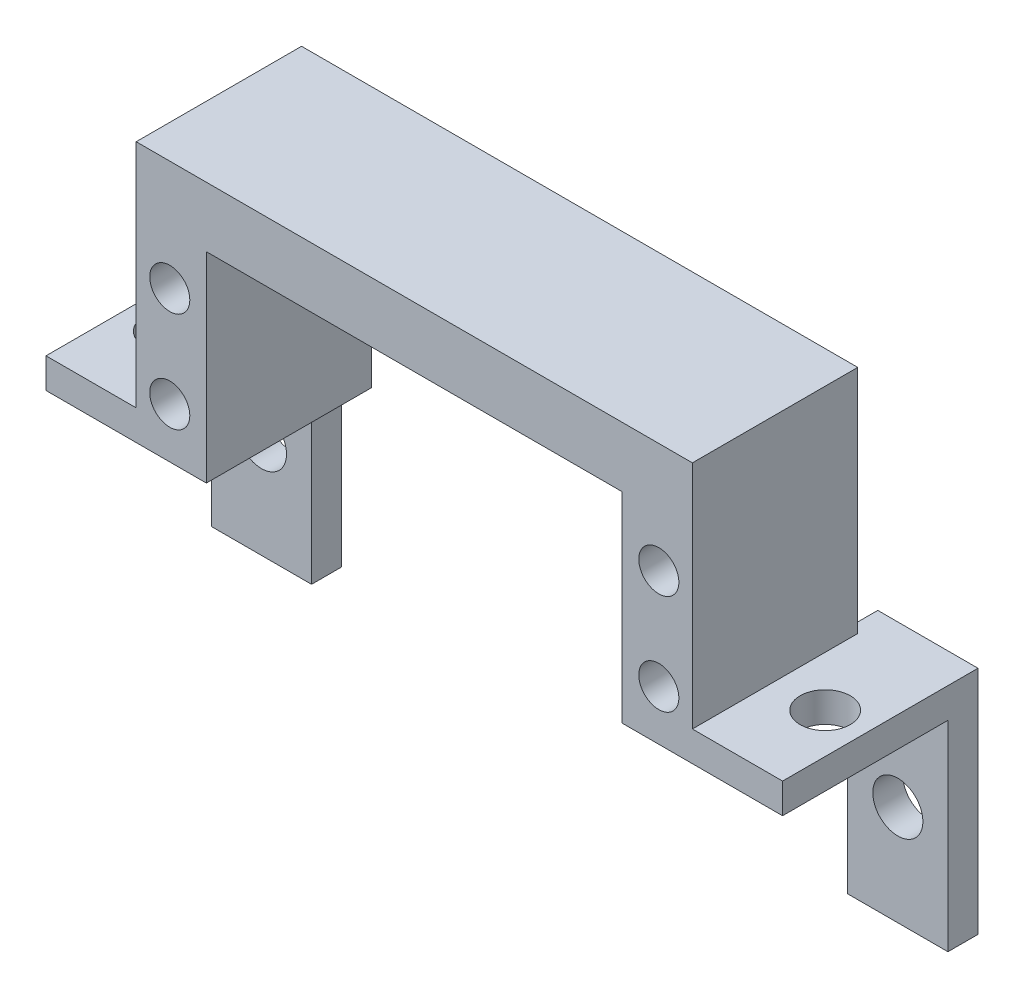
ISO-10303-21;
HEADER;
FILE_DESCRIPTION(('STEP AP214'),'2;1');
FILE_NAME('part.step','',(''),(''),'','','');
FILE_SCHEMA(('AUTOMOTIVE_DESIGN { 1 0 10303 214 1 1 1 1 }'));
ENDSEC;
DATA;
#1=APPLICATION_CONTEXT('core data for automotive mechanical design processes');
#2=APPLICATION_PROTOCOL_DEFINITION('international standard','automotive_design',2000,#1);
#3=PRODUCT_CONTEXT('',#1,'mechanical');
#4=PRODUCT('Part','Part','',(#3));
#5=PRODUCT_RELATED_PRODUCT_CATEGORY('part','',(#4));
#6=PRODUCT_DEFINITION_FORMATION('','',#4);
#7=PRODUCT_DEFINITION_CONTEXT('part definition',#1,'design');
#8=PRODUCT_DEFINITION('design','',#6,#7);
#9=PRODUCT_DEFINITION_SHAPE('','',#8);
#10=(LENGTH_UNIT() NAMED_UNIT(*) SI_UNIT(.MILLI.,.METRE.));
#11=(NAMED_UNIT(*) PLANE_ANGLE_UNIT() SI_UNIT($,.RADIAN.));
#12=(NAMED_UNIT(*) SI_UNIT($,.STERADIAN.) SOLID_ANGLE_UNIT());
#13=UNCERTAINTY_MEASURE_WITH_UNIT(LENGTH_MEASURE(1.E-05),#10,'distance_accuracy_value','');
#14=(GEOMETRIC_REPRESENTATION_CONTEXT(3) GLOBAL_UNCERTAINTY_ASSIGNED_CONTEXT((#13)) GLOBAL_UNIT_ASSIGNED_CONTEXT((#10,
#11,#12)) REPRESENTATION_CONTEXT('',''));
#15=CARTESIAN_POINT('',(0.,0.,0.));
#16=DIRECTION('',(0.,0.,1.));
#17=DIRECTION('',(1.,0.,0.));
#18=AXIS2_PLACEMENT_3D('',#15,#16,#17);
#19=CARTESIAN_POINT('',(0.,-23.,0.));
#20=DIRECTION('',(0.,-1.,0.));
#21=DIRECTION('',(0.,0.,-1.));
#22=AXIS2_PLACEMENT_3D('',#19,#20,#21);
#23=PLANE('',#22);
#24=CARTESIAN_POINT('',(32.75,-23.,8.25));
#25=DIRECTION('',(0.,-1.,0.));
#26=DIRECTION('',(0.,0.,-1.));
#27=AXIS2_PLACEMENT_3D('',#24,#25,#26);
#28=CIRCLE('',#27,2.5);
#29=CARTESIAN_POINT('',(32.75,-23.,5.75));
#30=VERTEX_POINT('',#29);
#31=EDGE_CURVE('E298',#30,#30,#28,.F.);
#32=ORIENTED_EDGE('',*,*,#31,.F.);
#33=EDGE_LOOP('',(#32));
#34=FACE_BOUND('',#33,.T.);
#35=DIRECTION('',(-1.,0.,0.));
#36=VECTOR('',#35,1.);
#37=CARTESIAN_POINT('',(27.75,-23.,0.));
#38=LINE('',#37,#36);
#39=CARTESIAN_POINT('',(27.75,-23.,0.));
#40=VERTEX_POINT('',#39);
#41=CARTESIAN_POINT('',(26.75,-23.,0.));
#42=VERTEX_POINT('',#41);
#43=EDGE_CURVE('E182',#40,#42,#38,.T.);
#44=ORIENTED_EDGE('',*,*,#43,.F.);
#45=DIRECTION('',(0.,0.,-1.));
#46=VECTOR('',#45,1.);
#47=CARTESIAN_POINT('',(27.75,-23.,16.5));
#48=LINE('',#47,#46);
#49=CARTESIAN_POINT('',(27.75,-23.,16.5));
#50=VERTEX_POINT('',#49);
#51=EDGE_CURVE('E170',#50,#40,#48,.T.);
#52=ORIENTED_EDGE('',*,*,#51,.F.);
#53=DIRECTION('',(1.,0.,0.));
#54=VECTOR('',#53,1.);
#55=CARTESIAN_POINT('',(36.75,-23.,16.5));
#56=LINE('',#55,#54);
#57=CARTESIAN_POINT('',(36.75,-23.,16.5));
#58=VERTEX_POINT('',#57);
#59=EDGE_CURVE('E296',#50,#58,#56,.T.);
#60=ORIENTED_EDGE('',*,*,#59,.T.);
#61=DIRECTION('',(0.,0.,-1.));
#62=VECTOR('',#61,1.);
#63=CARTESIAN_POINT('',(36.75,-23.,0.));
#64=LINE('',#63,#62);
#65=CARTESIAN_POINT('',(36.75,-23.,-3.));
#66=VERTEX_POINT('',#65);
#67=EDGE_CURVE('E294',#58,#66,#64,.T.);
#68=ORIENTED_EDGE('',*,*,#67,.T.);
#69=DIRECTION('',(1.,0.,0.));
#70=VECTOR('',#69,1.);
#71=CARTESIAN_POINT('',(26.75,-23.,-3.));
#72=LINE('',#71,#70);
#73=CARTESIAN_POINT('',(26.75,-23.,-3.));
#74=VERTEX_POINT('',#73);
#75=EDGE_CURVE('E247',#74,#66,#72,.T.);
#76=ORIENTED_EDGE('',*,*,#75,.F.);
#77=DIRECTION('',(0.,0.,1.));
#78=VECTOR('',#77,1.);
#79=CARTESIAN_POINT('',(26.75,-23.,-3.));
#80=LINE('',#79,#78);
#81=EDGE_CURVE('E189',#74,#42,#80,.T.);
#82=ORIENTED_EDGE('',*,*,#81,.T.);
#83=EDGE_LOOP('',(#44,#52,#60,#68,#76,#82));
#84=FACE_BOUND('',#83,.T.);
#85=ADVANCED_FACE('F37',(#34,#84),#23,.F.);
#86=CARTESIAN_POINT('',(0.,-23.,0.));
#87=DIRECTION('',(0.,1.,0.));
#88=DIRECTION('',(0.,0.,1.));
#89=AXIS2_PLACEMENT_3D('',#86,#87,#88);
#90=PLANE('',#89);
#91=CARTESIAN_POINT('',(-32.75,-23.,8.25));
#92=DIRECTION('',(0.,1.,0.));
#93=DIRECTION('',(0.,0.,1.));
#94=AXIS2_PLACEMENT_3D('',#91,#92,#93);
#95=CIRCLE('',#94,2.5);
#96=CARTESIAN_POINT('',(-32.75,-23.,10.75));
#97=VERTEX_POINT('',#96);
#98=EDGE_CURVE('E41',#97,#97,#95,.F.);
#99=ORIENTED_EDGE('',*,*,#98,.T.);
#100=EDGE_LOOP('',(#99));
#101=FACE_BOUND('',#100,.T.);
#102=DIRECTION('',(0.,0.,1.));
#103=VECTOR('',#102,1.);
#104=CARTESIAN_POINT('',(-27.75,-23.,0.));
#105=LINE('',#104,#103);
#106=CARTESIAN_POINT('',(-27.75,-23.,0.));
#107=VERTEX_POINT('',#106);
#108=CARTESIAN_POINT('',(-27.75,-23.,16.5));
#109=VERTEX_POINT('',#108);
#110=EDGE_CURVE('E63',#107,#109,#105,.T.);
#111=ORIENTED_EDGE('',*,*,#110,.F.);
#112=DIRECTION('',(1.,0.,0.));
#113=VECTOR('',#112,1.);
#114=CARTESIAN_POINT('',(-27.75,-23.,0.));
#115=LINE('',#114,#113);
#116=CARTESIAN_POINT('',(-26.75,-23.,0.));
#117=VERTEX_POINT('',#116);
#118=EDGE_CURVE('E202',#107,#117,#115,.T.);
#119=ORIENTED_EDGE('',*,*,#118,.T.);
#120=DIRECTION('',(0.,0.,1.));
#121=VECTOR('',#120,1.);
#122=CARTESIAN_POINT('',(-26.75,-23.,-3.));
#123=LINE('',#122,#121);
#124=CARTESIAN_POINT('',(-26.75,-23.,-3.));
#125=VERTEX_POINT('',#124);
#126=EDGE_CURVE('E228',#125,#117,#123,.T.);
#127=ORIENTED_EDGE('',*,*,#126,.F.);
#128=DIRECTION('',(1.,0.,0.));
#129=VECTOR('',#128,1.);
#130=CARTESIAN_POINT('',(-26.75,-23.,-3.));
#131=LINE('',#130,#129);
#132=CARTESIAN_POINT('',(-36.75,-23.,-3.));
#133=VERTEX_POINT('',#132);
#134=EDGE_CURVE('E226',#133,#125,#131,.T.);
#135=ORIENTED_EDGE('',*,*,#134,.F.);
#136=DIRECTION('',(0.,0.,1.));
#137=VECTOR('',#136,1.);
#138=CARTESIAN_POINT('',(-36.75,-23.,0.));
#139=LINE('',#138,#137);
#140=CARTESIAN_POINT('',(-36.75,-23.,16.5));
#141=VERTEX_POINT('',#140);
#142=EDGE_CURVE('E288',#133,#141,#139,.T.);
#143=ORIENTED_EDGE('',*,*,#142,.T.);
#144=DIRECTION('',(1.,0.,0.));
#145=VECTOR('',#144,1.);
#146=CARTESIAN_POINT('',(-36.75,-23.,16.5));
#147=LINE('',#146,#145);
#148=EDGE_CURVE('E292',#141,#109,#147,.T.);
#149=ORIENTED_EDGE('',*,*,#148,.T.);
#150=EDGE_LOOP('',(#111,#119,#127,#135,#143,#149));
#151=FACE_BOUND('',#150,.T.);
#152=ADVANCED_FACE('F361',(#101,#151),#90,.T.);
#153=CARTESIAN_POINT('',(0.,0.,0.));
#154=DIRECTION('',(0.,0.,1.));
#155=DIRECTION('',(1.,0.,0.));
#156=AXIS2_PLACEMENT_3D('',#153,#154,#155);
#157=PLANE('',#156);
#158=CARTESIAN_POINT('',(24.4,-21.,0.));
#159=DIRECTION('',(0.,0.,-1.));
#160=DIRECTION('',(-1.,0.,0.));
#161=AXIS2_PLACEMENT_3D('',#158,#159,#160);
#162=CIRCLE('',#161,2.00000000000001);
#163=CARTESIAN_POINT('',(22.4,-21.,0.));
#164=VERTEX_POINT('',#163);
#165=EDGE_CURVE('E271',#164,#164,#162,.T.);
#166=ORIENTED_EDGE('',*,*,#165,.F.);
#167=EDGE_LOOP('',(#166));
#168=FACE_BOUND('',#167,.T.);
#169=CARTESIAN_POINT('',(-24.4,-21.,0.));
#170=DIRECTION('',(0.,0.,-1.));
#171=DIRECTION('',(1.,0.,0.));
#172=AXIS2_PLACEMENT_3D('',#169,#170,#171);
#173=CIRCLE('',#172,2.00000000000001);
#174=CARTESIAN_POINT('',(-22.4,-21.,0.));
#175=VERTEX_POINT('',#174);
#176=EDGE_CURVE('E277',#175,#175,#173,.T.);
#177=ORIENTED_EDGE('',*,*,#176,.F.);
#178=EDGE_LOOP('',(#177));
#179=FACE_BOUND('',#178,.T.);
#180=CARTESIAN_POINT('',(-24.4,-11.,0.));
#181=DIRECTION('',(0.,0.,-1.));
#182=DIRECTION('',(1.,0.,0.));
#183=AXIS2_PLACEMENT_3D('',#180,#181,#182);
#184=CIRCLE('',#183,2.);
#185=CARTESIAN_POINT('',(-22.4,-11.,0.));
#186=VERTEX_POINT('',#185);
#187=EDGE_CURVE('E266',#186,#186,#184,.T.);
#188=ORIENTED_EDGE('',*,*,#187,.F.);
#189=EDGE_LOOP('',(#188));
#190=FACE_BOUND('',#189,.T.);
#191=CARTESIAN_POINT('',(24.4,-11.,0.));
#192=DIRECTION('',(0.,0.,-1.));
#193=DIRECTION('',(-1.,0.,0.));
#194=AXIS2_PLACEMENT_3D('',#191,#192,#193);
#195=CIRCLE('',#194,2.);
#196=CARTESIAN_POINT('',(22.4,-11.,0.));
#197=VERTEX_POINT('',#196);
#198=EDGE_CURVE('E270',#197,#197,#195,.T.);
#199=ORIENTED_EDGE('',*,*,#198,.F.);
#200=EDGE_LOOP('',(#199));
#201=FACE_BOUND('',#200,.T.);
#202=DIRECTION('',(0.,-1.,0.));
#203=VECTOR('',#202,1.);
#204=CARTESIAN_POINT('',(-26.75,-23.,0.));
#205=LINE('',#204,#203);
#206=CARTESIAN_POINT('',(-26.75,-26.,0.));
#207=VERTEX_POINT('',#206);
#208=EDGE_CURVE('E229',#117,#207,#205,.T.);
#209=ORIENTED_EDGE('',*,*,#208,.F.);
#210=ORIENTED_EDGE('',*,*,#118,.F.);
#211=DIRECTION('',(0.,-1.,0.));
#212=VECTOR('',#211,1.);
#213=CARTESIAN_POINT('',(-27.75,0.,0.));
#214=LINE('',#213,#212);
#215=CARTESIAN_POINT('',(-27.75,0.,0.));
#216=VERTEX_POINT('',#215);
#217=EDGE_CURVE('E190',#216,#107,#214,.T.);
#218=ORIENTED_EDGE('',*,*,#217,.F.);
#219=DIRECTION('',(-1.,0.,0.));
#220=VECTOR('',#219,1.);
#221=CARTESIAN_POINT('',(0.,0.,0.));
#222=LINE('',#221,#220);
#223=CARTESIAN_POINT('',(27.75,0.,0.));
#224=VERTEX_POINT('',#223);
#225=EDGE_CURVE('E184',#224,#216,#222,.T.);
#226=ORIENTED_EDGE('',*,*,#225,.F.);
#227=DIRECTION('',(0.,1.,0.));
#228=VECTOR('',#227,1.);
#229=CARTESIAN_POINT('',(27.75,0.,0.));
#230=LINE('',#229,#228);
#231=EDGE_CURVE('E173',#40,#224,#230,.T.);
#232=ORIENTED_EDGE('',*,*,#231,.F.);
#233=ORIENTED_EDGE('',*,*,#43,.T.);
#234=DIRECTION('',(0.,1.,0.));
#235=VECTOR('',#234,1.);
#236=CARTESIAN_POINT('',(26.75,-23.,0.));
#237=LINE('',#236,#235);
#238=CARTESIAN_POINT('',(26.75,-26.,0.));
#239=VERTEX_POINT('',#238);
#240=EDGE_CURVE('E11',#239,#42,#237,.T.);
#241=ORIENTED_EDGE('',*,*,#240,.F.);
#242=DIRECTION('',(1.,0.,0.));
#243=VECTOR('',#242,1.);
#244=CARTESIAN_POINT('',(20.75,-26.,0.));
#245=LINE('',#244,#243);
#246=CARTESIAN_POINT('',(20.75,-26.,0.));
#247=VERTEX_POINT('',#246);
#248=EDGE_CURVE('E306',#247,#239,#245,.T.);
#249=ORIENTED_EDGE('',*,*,#248,.F.);
#250=DIRECTION('',(0.,-1.,0.));
#251=VECTOR('',#250,1.);
#252=CARTESIAN_POINT('',(20.75,-6.,0.));
#253=LINE('',#252,#251);
#254=CARTESIAN_POINT('',(20.75,-6.,0.));
#255=VERTEX_POINT('',#254);
#256=EDGE_CURVE('E332',#255,#247,#253,.T.);
#257=ORIENTED_EDGE('',*,*,#256,.F.);
#258=DIRECTION('',(1.,0.,0.));
#259=VECTOR('',#258,1.);
#260=CARTESIAN_POINT('',(0.,-6.,0.));
#261=LINE('',#260,#259);
#262=CARTESIAN_POINT('',(-20.75,-6.,0.));
#263=VERTEX_POINT('',#262);
#264=EDGE_CURVE('E330',#263,#255,#261,.T.);
#265=ORIENTED_EDGE('',*,*,#264,.F.);
#266=DIRECTION('',(0.,1.,0.));
#267=VECTOR('',#266,1.);
#268=CARTESIAN_POINT('',(-20.75,-6.,0.));
#269=LINE('',#268,#267);
#270=CARTESIAN_POINT('',(-20.75,-26.,0.));
#271=VERTEX_POINT('',#270);
#272=EDGE_CURVE('E327',#271,#263,#269,.T.);
#273=ORIENTED_EDGE('',*,*,#272,.F.);
#274=DIRECTION('',(1.,0.,0.));
#275=VECTOR('',#274,1.);
#276=CARTESIAN_POINT('',(-20.75,-26.,0.));
#277=LINE('',#276,#275);
#278=EDGE_CURVE('E323',#207,#271,#277,.T.);
#279=ORIENTED_EDGE('',*,*,#278,.F.);
#280=EDGE_LOOP('',(#209,#210,#218,#226,#232,#233,#241,#249,#257,#265,#273,#279));
#281=FACE_BOUND('',#280,.T.);
#282=ADVANCED_FACE('F181',(#168,#179,#190,#201,#281),#157,.F.);
#283=CARTESIAN_POINT('',(-36.75,-20.,16.5));
#284=DIRECTION('',(1.,0.,0.));
#285=DIRECTION('',(0.,0.,-1.));
#286=AXIS2_PLACEMENT_3D('',#283,#284,#285);
#287=PLANE('',#286);
#288=ORIENTED_EDGE('',*,*,#142,.F.);
#289=DIRECTION('',(0.,1.,0.));
#290=VECTOR('',#289,1.);
#291=CARTESIAN_POINT('',(-36.75,-23.,-3.));
#292=LINE('',#291,#290);
#293=CARTESIAN_POINT('',(-36.75,-46.,-3.));
#294=VERTEX_POINT('',#293);
#295=EDGE_CURVE('E223',#294,#133,#292,.T.);
#296=ORIENTED_EDGE('',*,*,#295,.F.);
#297=DIRECTION('',(0.,0.,1.));
#298=VECTOR('',#297,1.);
#299=CARTESIAN_POINT('',(-36.75,-46.,-3.));
#300=LINE('',#299,#298);
#301=CARTESIAN_POINT('',(-36.75,-46.,0.));
#302=VERTEX_POINT('',#301);
#303=EDGE_CURVE('E238',#294,#302,#300,.T.);
#304=ORIENTED_EDGE('',*,*,#303,.T.);
#305=DIRECTION('',(0.,1.,0.));
#306=VECTOR('',#305,1.);
#307=CARTESIAN_POINT('',(-36.75,-23.,0.));
#308=LINE('',#307,#306);
#309=CARTESIAN_POINT('',(-36.75,-26.,0.));
#310=VERTEX_POINT('',#309);
#311=EDGE_CURVE('E221',#302,#310,#308,.T.);
#312=ORIENTED_EDGE('',*,*,#311,.T.);
#313=DIRECTION('',(0.,0.,-1.));
#314=VECTOR('',#313,1.);
#315=CARTESIAN_POINT('',(-36.75,-26.,16.5));
#316=LINE('',#315,#314);
#317=CARTESIAN_POINT('',(-36.75,-26.,16.5));
#318=VERTEX_POINT('',#317);
#319=EDGE_CURVE('E46',#318,#310,#316,.T.);
#320=ORIENTED_EDGE('',*,*,#319,.F.);
#321=DIRECTION('',(0.,-1.,0.));
#322=VECTOR('',#321,1.);
#323=CARTESIAN_POINT('',(-36.75,-20.,16.5));
#324=LINE('',#323,#322);
#325=EDGE_CURVE('E305',#141,#318,#324,.T.);
#326=ORIENTED_EDGE('',*,*,#325,.F.);
#327=EDGE_LOOP('',(#288,#296,#304,#312,#320,#326));
#328=FACE_BOUND('',#327,.T.);
#329=ADVANCED_FACE('F373',(#328),#287,.F.);
#330=CARTESIAN_POINT('',(-32.75,-36.5,8.25));
#331=DIRECTION('',(0.,1.,0.));
#332=DIRECTION('',(0.,0.,1.));
#333=AXIS2_PLACEMENT_3D('',#330,#331,#332);
#334=CYLINDRICAL_SURFACE('',#333,2.5);
#335=CARTESIAN_POINT('',(-32.75,-26.,8.25));
#336=DIRECTION('',(0.,1.,0.));
#337=DIRECTION('',(-1.,0.,0.));
#338=AXIS2_PLACEMENT_3D('',#335,#336,#337);
#339=CIRCLE('',#338,2.5);
#340=CARTESIAN_POINT('',(-35.25,-26.,8.25));
#341=VERTEX_POINT('',#340);
#342=EDGE_CURVE('E302',#341,#341,#339,.T.);
#343=ORIENTED_EDGE('',*,*,#342,.F.);
#344=EDGE_LOOP('',(#343));
#345=FACE_BOUND('',#344,.T.);
#346=ORIENTED_EDGE('',*,*,#98,.F.);
#347=EDGE_LOOP('',(#346));
#348=FACE_BOUND('',#347,.T.);
#349=ADVANCED_FACE('F370',(#345,#348),#334,.F.);
#350=CARTESIAN_POINT('',(0.,0.,16.5));
#351=DIRECTION('',(0.,-1.,0.));
#352=DIRECTION('',(0.,0.,-1.));
#353=AXIS2_PLACEMENT_3D('',#350,#351,#352);
#354=PLANE('',#353);
#355=ORIENTED_EDGE('',*,*,#225,.T.);
#356=DIRECTION('',(0.,0.,-1.));
#357=VECTOR('',#356,1.);
#358=CARTESIAN_POINT('',(-27.75,0.,0.));
#359=LINE('',#358,#357);
#360=CARTESIAN_POINT('',(-27.75,0.,16.5));
#361=VERTEX_POINT('',#360);
#362=EDGE_CURVE('E199',#361,#216,#359,.T.);
#363=ORIENTED_EDGE('',*,*,#362,.F.);
#364=DIRECTION('',(-1.,0.,0.));
#365=VECTOR('',#364,1.);
#366=CARTESIAN_POINT('',(0.,0.,16.5));
#367=LINE('',#366,#365);
#368=CARTESIAN_POINT('',(27.75,0.,16.5));
#369=VERTEX_POINT('',#368);
#370=EDGE_CURVE('E303',#369,#361,#367,.T.);
#371=ORIENTED_EDGE('',*,*,#370,.F.);
#372=DIRECTION('',(0.,0.,1.));
#373=VECTOR('',#372,1.);
#374=CARTESIAN_POINT('',(27.75,0.,16.5));
#375=LINE('',#374,#373);
#376=EDGE_CURVE('E185',#224,#369,#375,.T.);
#377=ORIENTED_EDGE('',*,*,#376,.F.);
#378=EDGE_LOOP('',(#355,#363,#371,#377));
#379=FACE_BOUND('',#378,.T.);
#380=ADVANCED_FACE('F39',(#379),#354,.F.);
#381=CARTESIAN_POINT('',(-20.75,-26.,16.5));
#382=DIRECTION('',(0.,1.,0.));
#383=DIRECTION('',(-1.,0.,0.));
#384=AXIS2_PLACEMENT_3D('',#381,#382,#383);
#385=PLANE('',#384);
#386=ORIENTED_EDGE('',*,*,#342,.T.);
#387=EDGE_LOOP('',(#386));
#388=FACE_BOUND('',#387,.T.);
#389=EDGE_CURVE('E324',#310,#207,#277,.T.);
#390=ORIENTED_EDGE('',*,*,#389,.T.);
#391=ORIENTED_EDGE('',*,*,#278,.T.);
#392=DIRECTION('',(0.,0.,-1.));
#393=VECTOR('',#392,1.);
#394=CARTESIAN_POINT('',(-20.75,-26.,16.5));
#395=LINE('',#394,#393);
#396=CARTESIAN_POINT('',(-20.75,-26.,16.5));
#397=VERTEX_POINT('',#396);
#398=EDGE_CURVE('E348',#397,#271,#395,.T.);
#399=ORIENTED_EDGE('',*,*,#398,.F.);
#400=DIRECTION('',(1.,0.,0.));
#401=VECTOR('',#400,1.);
#402=CARTESIAN_POINT('',(-20.75,-26.,16.5));
#403=LINE('',#402,#401);
#404=EDGE_CURVE('E308',#318,#397,#403,.T.);
#405=ORIENTED_EDGE('',*,*,#404,.F.);
#406=ORIENTED_EDGE('',*,*,#319,.T.);
#407=EDGE_LOOP('',(#390,#391,#399,#405,#406));
#408=FACE_BOUND('',#407,.T.);
#409=ADVANCED_FACE('F404',(#388,#408),#385,.F.);
#410=CARTESIAN_POINT('',(-20.75,-6.,16.5));
#411=DIRECTION('',(-1.,0.,0.));
#412=DIRECTION('',(0.,-1.,0.));
#413=AXIS2_PLACEMENT_3D('',#410,#411,#412);
#414=PLANE('',#413);
#415=ORIENTED_EDGE('',*,*,#272,.T.);
#416=DIRECTION('',(0.,0.,-1.));
#417=VECTOR('',#416,1.);
#418=CARTESIAN_POINT('',(-20.75,-6.,16.5));
#419=LINE('',#418,#417);
#420=CARTESIAN_POINT('',(-20.75,-6.,16.5));
#421=VERTEX_POINT('',#420);
#422=EDGE_CURVE('E345',#421,#263,#419,.T.);
#423=ORIENTED_EDGE('',*,*,#422,.F.);
#424=DIRECTION('',(0.,1.,0.));
#425=VECTOR('',#424,1.);
#426=CARTESIAN_POINT('',(-20.75,-6.,16.5));
#427=LINE('',#426,#425);
#428=EDGE_CURVE('E310',#397,#421,#427,.T.);
#429=ORIENTED_EDGE('',*,*,#428,.F.);
#430=ORIENTED_EDGE('',*,*,#398,.T.);
#431=EDGE_LOOP('',(#415,#423,#429,#430));
#432=FACE_BOUND('',#431,.T.);
#433=ADVANCED_FACE('F400',(#432),#414,.F.);
#434=CARTESIAN_POINT('',(0.,-6.,16.5));
#435=DIRECTION('',(0.,1.,0.));
#436=DIRECTION('',(0.,0.,1.));
#437=AXIS2_PLACEMENT_3D('',#434,#435,#436);
#438=PLANE('',#437);
#439=ORIENTED_EDGE('',*,*,#264,.T.);
#440=DIRECTION('',(0.,0.,-1.));
#441=VECTOR('',#440,1.);
#442=CARTESIAN_POINT('',(20.75,-6.,16.5));
#443=LINE('',#442,#441);
#444=CARTESIAN_POINT('',(20.75,-6.,16.5));
#445=VERTEX_POINT('',#444);
#446=EDGE_CURVE('E342',#445,#255,#443,.T.);
#447=ORIENTED_EDGE('',*,*,#446,.F.);
#448=DIRECTION('',(1.,0.,0.));
#449=VECTOR('',#448,1.);
#450=CARTESIAN_POINT('',(0.,-6.,16.5));
#451=LINE('',#450,#449);
#452=EDGE_CURVE('E312',#421,#445,#451,.T.);
#453=ORIENTED_EDGE('',*,*,#452,.F.);
#454=ORIENTED_EDGE('',*,*,#422,.T.);
#455=EDGE_LOOP('',(#439,#447,#453,#454));
#456=FACE_BOUND('',#455,.T.);
#457=ADVANCED_FACE('F396',(#456),#438,.F.);
#458=CARTESIAN_POINT('',(20.75,-6.,16.5));
#459=DIRECTION('',(1.,0.,0.));
#460=DIRECTION('',(0.,1.,0.));
#461=AXIS2_PLACEMENT_3D('',#458,#459,#460);
#462=PLANE('',#461);
#463=ORIENTED_EDGE('',*,*,#256,.T.);
#464=DIRECTION('',(0.,0.,-1.));
#465=VECTOR('',#464,1.);
#466=CARTESIAN_POINT('',(20.75,-26.,16.5));
#467=LINE('',#466,#465);
#468=CARTESIAN_POINT('',(20.75,-26.,16.5));
#469=VERTEX_POINT('',#468);
#470=EDGE_CURVE('E339',#469,#247,#467,.T.);
#471=ORIENTED_EDGE('',*,*,#470,.F.);
#472=DIRECTION('',(0.,-1.,0.));
#473=VECTOR('',#472,1.);
#474=CARTESIAN_POINT('',(20.75,-6.,16.5));
#475=LINE('',#474,#473);
#476=EDGE_CURVE('E314',#445,#469,#475,.T.);
#477=ORIENTED_EDGE('',*,*,#476,.F.);
#478=ORIENTED_EDGE('',*,*,#446,.T.);
#479=EDGE_LOOP('',(#463,#471,#477,#478));
#480=FACE_BOUND('',#479,.T.);
#481=ADVANCED_FACE('F392',(#480),#462,.F.);
#482=CARTESIAN_POINT('',(20.75,-26.,16.5));
#483=DIRECTION('',(0.,1.,0.));
#484=DIRECTION('',(-1.,0.,0.));
#485=AXIS2_PLACEMENT_3D('',#482,#483,#484);
#486=PLANE('',#485);
#487=CARTESIAN_POINT('',(32.75,-26.,8.25));
#488=DIRECTION('',(0.,1.,0.));
#489=DIRECTION('',(-1.,0.,0.));
#490=AXIS2_PLACEMENT_3D('',#487,#488,#489);
#491=CIRCLE('',#490,2.5);
#492=CARTESIAN_POINT('',(30.25,-26.,8.25));
#493=VERTEX_POINT('',#492);
#494=EDGE_CURVE('E299',#493,#493,#491,.T.);
#495=ORIENTED_EDGE('',*,*,#494,.T.);
#496=EDGE_LOOP('',(#495));
#497=FACE_BOUND('',#496,.T.);
#498=ORIENTED_EDGE('',*,*,#248,.T.);
#499=CARTESIAN_POINT('',(36.75,-26.,0.));
#500=VERTEX_POINT('',#499);
#501=EDGE_CURVE('E334',#239,#500,#245,.T.);
#502=ORIENTED_EDGE('',*,*,#501,.T.);
#503=DIRECTION('',(0.,0.,-1.));
#504=VECTOR('',#503,1.);
#505=CARTESIAN_POINT('',(36.75,-26.,16.5));
#506=LINE('',#505,#504);
#507=CARTESIAN_POINT('',(36.75,-26.,16.5));
#508=VERTEX_POINT('',#507);
#509=EDGE_CURVE('E321',#508,#500,#506,.T.);
#510=ORIENTED_EDGE('',*,*,#509,.F.);
#511=DIRECTION('',(1.,0.,0.));
#512=VECTOR('',#511,1.);
#513=CARTESIAN_POINT('',(20.75,-26.,16.5));
#514=LINE('',#513,#512);
#515=EDGE_CURVE('E316',#469,#508,#514,.T.);
#516=ORIENTED_EDGE('',*,*,#515,.F.);
#517=ORIENTED_EDGE('',*,*,#470,.T.);
#518=EDGE_LOOP('',(#498,#502,#510,#516,#517));
#519=FACE_BOUND('',#518,.T.);
#520=ADVANCED_FACE('F388',(#497,#519),#486,.F.);
#521=CARTESIAN_POINT('',(36.75,-20.,16.5));
#522=DIRECTION('',(-1.,0.,0.));
#523=DIRECTION('',(0.,0.,1.));
#524=AXIS2_PLACEMENT_3D('',#521,#522,#523);
#525=PLANE('',#524);
#526=ORIENTED_EDGE('',*,*,#509,.T.);
#527=DIRECTION('',(0.,-1.,0.));
#528=VECTOR('',#527,1.);
#529=CARTESIAN_POINT('',(36.75,-23.,0.));
#530=LINE('',#529,#528);
#531=CARTESIAN_POINT('',(36.75,-46.,0.));
#532=VERTEX_POINT('',#531);
#533=EDGE_CURVE('E257',#500,#532,#530,.T.);
#534=ORIENTED_EDGE('',*,*,#533,.T.);
#535=DIRECTION('',(0.,0.,1.));
#536=VECTOR('',#535,1.);
#537=CARTESIAN_POINT('',(36.75,-46.,-3.));
#538=LINE('',#537,#536);
#539=CARTESIAN_POINT('',(36.75,-46.,-3.));
#540=VERTEX_POINT('',#539);
#541=EDGE_CURVE('E262',#540,#532,#538,.T.);
#542=ORIENTED_EDGE('',*,*,#541,.F.);
#543=DIRECTION('',(0.,-1.,0.));
#544=VECTOR('',#543,1.);
#545=CARTESIAN_POINT('',(36.75,-23.,-3.));
#546=LINE('',#545,#544);
#547=EDGE_CURVE('E251',#66,#540,#546,.T.);
#548=ORIENTED_EDGE('',*,*,#547,.F.);
#549=ORIENTED_EDGE('',*,*,#67,.F.);
#550=DIRECTION('',(0.,1.,0.));
#551=VECTOR('',#550,1.);
#552=CARTESIAN_POINT('',(36.75,-20.,16.5));
#553=LINE('',#552,#551);
#554=EDGE_CURVE('E318',#508,#58,#553,.T.);
#555=ORIENTED_EDGE('',*,*,#554,.F.);
#556=EDGE_LOOP('',(#526,#534,#542,#548,#549,#555));
#557=FACE_BOUND('',#556,.T.);
#558=ADVANCED_FACE('F381',(#557),#525,.F.);
#559=CARTESIAN_POINT('',(0.,0.,16.5));
#560=DIRECTION('',(0.,0.,1.));
#561=DIRECTION('',(1.,0.,0.));
#562=AXIS2_PLACEMENT_3D('',#559,#560,#561);
#563=PLANE('',#562);
#564=DIRECTION('',(0.,-1.,0.));
#565=VECTOR('',#564,1.);
#566=CARTESIAN_POINT('',(27.75,0.,16.5));
#567=LINE('',#566,#565);
#568=EDGE_CURVE('E55',#369,#50,#567,.T.);
#569=ORIENTED_EDGE('',*,*,#568,.F.);
#570=ORIENTED_EDGE('',*,*,#370,.T.);
#571=DIRECTION('',(0.,1.,0.));
#572=VECTOR('',#571,1.);
#573=CARTESIAN_POINT('',(-27.75,0.,16.5));
#574=LINE('',#573,#572);
#575=EDGE_CURVE('E196',#109,#361,#574,.T.);
#576=ORIENTED_EDGE('',*,*,#575,.F.);
#577=ORIENTED_EDGE('',*,*,#148,.F.);
#578=ORIENTED_EDGE('',*,*,#325,.T.);
#579=ORIENTED_EDGE('',*,*,#404,.T.);
#580=ORIENTED_EDGE('',*,*,#428,.T.);
#581=ORIENTED_EDGE('',*,*,#452,.T.);
#582=ORIENTED_EDGE('',*,*,#476,.T.);
#583=ORIENTED_EDGE('',*,*,#515,.T.);
#584=ORIENTED_EDGE('',*,*,#554,.T.);
#585=ORIENTED_EDGE('',*,*,#59,.F.);
#586=EDGE_LOOP('',(#569,#570,#576,#577,#578,#579,#580,#581,#582,#583,#584,#585));
#587=FACE_BOUND('',#586,.T.);
#588=CARTESIAN_POINT('',(24.4,-21.,16.5));
#589=DIRECTION('',(0.,0.,-1.));
#590=DIRECTION('',(-1.,0.,0.));
#591=AXIS2_PLACEMENT_3D('',#588,#589,#590);
#592=CIRCLE('',#591,2.00000000000001);
#593=CARTESIAN_POINT('',(22.4,-21.,16.5));
#594=VERTEX_POINT('',#593);
#595=EDGE_CURVE('E267',#594,#594,#592,.T.);
#596=ORIENTED_EDGE('',*,*,#595,.T.);
#597=EDGE_LOOP('',(#596));
#598=FACE_BOUND('',#597,.T.);
#599=CARTESIAN_POINT('',(-24.4,-21.,16.5));
#600=DIRECTION('',(0.,0.,-1.));
#601=DIRECTION('',(1.,0.,0.));
#602=AXIS2_PLACEMENT_3D('',#599,#600,#601);
#603=CIRCLE('',#602,2.00000000000001);
#604=CARTESIAN_POINT('',(-22.4,-21.,16.5));
#605=VERTEX_POINT('',#604);
#606=EDGE_CURVE('E274',#605,#605,#603,.T.);
#607=ORIENTED_EDGE('',*,*,#606,.T.);
#608=EDGE_LOOP('',(#607));
#609=FACE_BOUND('',#608,.T.);
#610=CARTESIAN_POINT('',(-24.4,-11.,16.5));
#611=DIRECTION('',(0.,0.,-1.));
#612=DIRECTION('',(1.,0.,0.));
#613=AXIS2_PLACEMENT_3D('',#610,#611,#612);
#614=CIRCLE('',#613,2.);
#615=CARTESIAN_POINT('',(-22.4,-11.,16.5));
#616=VERTEX_POINT('',#615);
#617=EDGE_CURVE('E280',#616,#616,#614,.T.);
#618=ORIENTED_EDGE('',*,*,#617,.T.);
#619=EDGE_LOOP('',(#618));
#620=FACE_BOUND('',#619,.T.);
#621=CARTESIAN_POINT('',(24.4,-11.,16.5));
#622=DIRECTION('',(0.,0.,-1.));
#623=DIRECTION('',(-1.,0.,0.));
#624=AXIS2_PLACEMENT_3D('',#621,#622,#623);
#625=CIRCLE('',#624,2.);
#626=CARTESIAN_POINT('',(22.4,-11.,16.5));
#627=VERTEX_POINT('',#626);
#628=EDGE_CURVE('E285',#627,#627,#625,.T.);
#629=ORIENTED_EDGE('',*,*,#628,.T.);
#630=EDGE_LOOP('',(#629));
#631=FACE_BOUND('',#630,.T.);
#632=ADVANCED_FACE('F378',(#587,#598,#609,#620,#631),#563,.T.);
#633=CARTESIAN_POINT('',(32.75,-36.5,8.25));
#634=DIRECTION('',(0.,1.,0.));
#635=DIRECTION('',(0.,0.,1.));
#636=AXIS2_PLACEMENT_3D('',#633,#634,#635);
#637=CYLINDRICAL_SURFACE('',#636,2.5);
#638=ORIENTED_EDGE('',*,*,#31,.T.);
#639=EDGE_LOOP('',(#638));
#640=FACE_BOUND('',#639,.T.);
#641=ORIENTED_EDGE('',*,*,#494,.F.);
#642=EDGE_LOOP('',(#641));
#643=FACE_BOUND('',#642,.T.);
#644=ADVANCED_FACE('F357',(#640,#643),#637,.F.);
#645=CARTESIAN_POINT('',(24.4,-11.,16.5));
#646=DIRECTION('',(0.,0.,-1.));
#647=DIRECTION('',(-1.,0.,0.));
#648=AXIS2_PLACEMENT_3D('',#645,#646,#647);
#649=CYLINDRICAL_SURFACE('',#648,2.);
#650=ORIENTED_EDGE('',*,*,#628,.F.);
#651=EDGE_LOOP('',(#650));
#652=FACE_BOUND('',#651,.T.);
#653=ORIENTED_EDGE('',*,*,#198,.T.);
#654=EDGE_LOOP('',(#653));
#655=FACE_BOUND('',#654,.T.);
#656=ADVANCED_FACE('F377',(#652,#655),#649,.F.);
#657=CARTESIAN_POINT('',(-24.4,-11.,16.5));
#658=DIRECTION('',(0.,0.,-1.));
#659=DIRECTION('',(-1.,0.,0.));
#660=AXIS2_PLACEMENT_3D('',#657,#658,#659);
#661=CYLINDRICAL_SURFACE('',#660,2.);
#662=ORIENTED_EDGE('',*,*,#617,.F.);
#663=EDGE_LOOP('',(#662));
#664=FACE_BOUND('',#663,.T.);
#665=ORIENTED_EDGE('',*,*,#187,.T.);
#666=EDGE_LOOP('',(#665));
#667=FACE_BOUND('',#666,.T.);
#668=ADVANCED_FACE('F491',(#664,#667),#661,.F.);
#669=CARTESIAN_POINT('',(-24.4,-21.,16.5));
#670=DIRECTION('',(0.,0.,-1.));
#671=DIRECTION('',(-1.,0.,0.));
#672=AXIS2_PLACEMENT_3D('',#669,#670,#671);
#673=CYLINDRICAL_SURFACE('',#672,2.00000000000001);
#674=ORIENTED_EDGE('',*,*,#606,.F.);
#675=EDGE_LOOP('',(#674));
#676=FACE_BOUND('',#675,.T.);
#677=ORIENTED_EDGE('',*,*,#176,.T.);
#678=EDGE_LOOP('',(#677));
#679=FACE_BOUND('',#678,.T.);
#680=ADVANCED_FACE('F481',(#676,#679),#673,.F.);
#681=CARTESIAN_POINT('',(24.4,-21.,16.5));
#682=DIRECTION('',(0.,0.,-1.));
#683=DIRECTION('',(-1.,0.,0.));
#684=AXIS2_PLACEMENT_3D('',#681,#682,#683);
#685=CYLINDRICAL_SURFACE('',#684,2.00000000000001);
#686=ORIENTED_EDGE('',*,*,#595,.F.);
#687=EDGE_LOOP('',(#686));
#688=FACE_BOUND('',#687,.T.);
#689=ORIENTED_EDGE('',*,*,#165,.T.);
#690=EDGE_LOOP('',(#689));
#691=FACE_BOUND('',#690,.T.);
#692=ADVANCED_FACE('F473',(#688,#691),#685,.F.);
#693=CARTESIAN_POINT('',(0.,0.,0.));
#694=DIRECTION('',(0.,0.,1.));
#695=DIRECTION('',(1.,0.,0.));
#696=AXIS2_PLACEMENT_3D('',#693,#694,#695);
#697=PLANE('',#696);
#698=CARTESIAN_POINT('',(31.75,-36.,0.));
#699=DIRECTION('',(0.,0.,-1.));
#700=DIRECTION('',(-1.,0.,0.));
#701=AXIS2_PLACEMENT_3D('',#698,#699,#700);
#702=CIRCLE('',#701,2.5);
#703=CARTESIAN_POINT('',(29.25,-36.,0.));
#704=VERTEX_POINT('',#703);
#705=EDGE_CURVE('E211',#704,#704,#702,.T.);
#706=ORIENTED_EDGE('',*,*,#705,.T.);
#707=EDGE_LOOP('',(#706));
#708=FACE_BOUND('',#707,.T.);
#709=ORIENTED_EDGE('',*,*,#501,.F.);
#710=CARTESIAN_POINT('',(26.75,-46.,0.));
#711=VERTEX_POINT('',#710);
#712=EDGE_CURVE('E48',#711,#239,#237,.T.);
#713=ORIENTED_EDGE('',*,*,#712,.F.);
#714=DIRECTION('',(-1.,0.,0.));
#715=VECTOR('',#714,1.);
#716=CARTESIAN_POINT('',(26.75,-46.,0.));
#717=LINE('',#716,#715);
#718=EDGE_CURVE('E248',#532,#711,#717,.T.);
#719=ORIENTED_EDGE('',*,*,#718,.F.);
#720=ORIENTED_EDGE('',*,*,#533,.F.);
#721=EDGE_LOOP('',(#709,#713,#719,#720));
#722=FACE_BOUND('',#721,.T.);
#723=ADVANCED_FACE('F471',(#708,#722),#697,.T.);
#724=CARTESIAN_POINT('',(26.75,-23.,-3.));
#725=DIRECTION('',(1.,0.,0.));
#726=DIRECTION('',(0.,1.,0.));
#727=AXIS2_PLACEMENT_3D('',#724,#725,#726);
#728=PLANE('',#727);
#729=ORIENTED_EDGE('',*,*,#712,.T.);
#730=ORIENTED_EDGE('',*,*,#240,.T.);
#731=ORIENTED_EDGE('',*,*,#81,.F.);
#732=DIRECTION('',(0.,1.,0.));
#733=VECTOR('',#732,1.);
#734=CARTESIAN_POINT('',(26.75,-23.,-3.));
#735=LINE('',#734,#733);
#736=CARTESIAN_POINT('',(26.75,-46.,-3.));
#737=VERTEX_POINT('',#736);
#738=EDGE_CURVE('E244',#737,#74,#735,.T.);
#739=ORIENTED_EDGE('',*,*,#738,.F.);
#740=DIRECTION('',(0.,0.,1.));
#741=VECTOR('',#740,1.);
#742=CARTESIAN_POINT('',(26.75,-46.,-3.));
#743=LINE('',#742,#741);
#744=EDGE_CURVE('E254',#737,#711,#743,.T.);
#745=ORIENTED_EDGE('',*,*,#744,.T.);
#746=EDGE_LOOP('',(#729,#730,#731,#739,#745));
#747=FACE_BOUND('',#746,.T.);
#748=ADVANCED_FACE('F469',(#747),#728,.F.);
#749=CARTESIAN_POINT('',(26.75,-46.,-3.));
#750=DIRECTION('',(0.,1.,0.));
#751=DIRECTION('',(-1.,0.,0.));
#752=AXIS2_PLACEMENT_3D('',#749,#750,#751);
#753=PLANE('',#752);
#754=ORIENTED_EDGE('',*,*,#718,.T.);
#755=ORIENTED_EDGE('',*,*,#744,.F.);
#756=DIRECTION('',(-1.,0.,0.));
#757=VECTOR('',#756,1.);
#758=CARTESIAN_POINT('',(26.75,-46.,-3.));
#759=LINE('',#758,#757);
#760=EDGE_CURVE('E253',#540,#737,#759,.T.);
#761=ORIENTED_EDGE('',*,*,#760,.F.);
#762=ORIENTED_EDGE('',*,*,#541,.T.);
#763=EDGE_LOOP('',(#754,#755,#761,#762));
#764=FACE_BOUND('',#763,.T.);
#765=ADVANCED_FACE('F466',(#764),#753,.F.);
#766=CARTESIAN_POINT('',(0.,0.,-3.));
#767=DIRECTION('',(0.,0.,1.));
#768=DIRECTION('',(1.,0.,0.));
#769=AXIS2_PLACEMENT_3D('',#766,#767,#768);
#770=PLANE('',#769);
#771=CARTESIAN_POINT('',(31.75,-36.,-3.));
#772=DIRECTION('',(0.,0.,-1.));
#773=DIRECTION('',(-1.,0.,0.));
#774=AXIS2_PLACEMENT_3D('',#771,#772,#773);
#775=CIRCLE('',#774,2.5);
#776=CARTESIAN_POINT('',(29.25,-36.,-3.));
#777=VERTEX_POINT('',#776);
#778=EDGE_CURVE('E208',#777,#777,#775,.T.);
#779=ORIENTED_EDGE('',*,*,#778,.F.);
#780=EDGE_LOOP('',(#779));
#781=FACE_BOUND('',#780,.T.);
#782=ORIENTED_EDGE('',*,*,#738,.T.);
#783=ORIENTED_EDGE('',*,*,#75,.T.);
#784=ORIENTED_EDGE('',*,*,#547,.T.);
#785=ORIENTED_EDGE('',*,*,#760,.T.);
#786=EDGE_LOOP('',(#782,#783,#784,#785));
#787=FACE_BOUND('',#786,.T.);
#788=ADVANCED_FACE('F459',(#781,#787),#770,.F.);
#789=CARTESIAN_POINT('',(0.,0.,0.));
#790=DIRECTION('',(0.,0.,-1.));
#791=DIRECTION('',(-1.,0.,0.));
#792=AXIS2_PLACEMENT_3D('',#789,#790,#791);
#793=PLANE('',#792);
#794=CARTESIAN_POINT('',(-31.75,-36.,0.));
#795=DIRECTION('',(0.,0.,-1.));
#796=DIRECTION('',(-1.,0.,0.));
#797=AXIS2_PLACEMENT_3D('',#794,#795,#796);
#798=CIRCLE('',#797,2.5);
#799=CARTESIAN_POINT('',(-34.25,-36.,0.));
#800=VERTEX_POINT('',#799);
#801=EDGE_CURVE('E205',#800,#800,#798,.T.);
#802=ORIENTED_EDGE('',*,*,#801,.T.);
#803=EDGE_LOOP('',(#802));
#804=FACE_BOUND('',#803,.T.);
#805=CARTESIAN_POINT('',(-26.75,-46.,0.));
#806=VERTEX_POINT('',#805);
#807=EDGE_CURVE('E214',#207,#806,#205,.T.);
#808=ORIENTED_EDGE('',*,*,#807,.F.);
#809=ORIENTED_EDGE('',*,*,#389,.F.);
#810=ORIENTED_EDGE('',*,*,#311,.F.);
#811=DIRECTION('',(-1.,0.,0.));
#812=VECTOR('',#811,1.);
#813=CARTESIAN_POINT('',(-26.75,-46.,0.));
#814=LINE('',#813,#812);
#815=EDGE_CURVE('E232',#806,#302,#814,.T.);
#816=ORIENTED_EDGE('',*,*,#815,.F.);
#817=EDGE_LOOP('',(#808,#809,#810,#816));
#818=FACE_BOUND('',#817,.T.);
#819=ADVANCED_FACE('F431',(#804,#818),#793,.F.);
#820=CARTESIAN_POINT('',(-26.75,-23.,-3.));
#821=DIRECTION('',(-1.,0.,0.));
#822=DIRECTION('',(0.,0.,1.));
#823=AXIS2_PLACEMENT_3D('',#820,#821,#822);
#824=PLANE('',#823);
#825=ORIENTED_EDGE('',*,*,#208,.T.);
#826=ORIENTED_EDGE('',*,*,#807,.T.);
#827=DIRECTION('',(0.,0.,1.));
#828=VECTOR('',#827,1.);
#829=CARTESIAN_POINT('',(-26.75,-46.,-3.));
#830=LINE('',#829,#828);
#831=CARTESIAN_POINT('',(-26.75,-46.,-3.));
#832=VERTEX_POINT('',#831);
#833=EDGE_CURVE('E241',#832,#806,#830,.T.);
#834=ORIENTED_EDGE('',*,*,#833,.F.);
#835=DIRECTION('',(0.,-1.,0.));
#836=VECTOR('',#835,1.);
#837=CARTESIAN_POINT('',(-26.75,-23.,-3.));
#838=LINE('',#837,#836);
#839=EDGE_CURVE('E217',#125,#832,#838,.T.);
#840=ORIENTED_EDGE('',*,*,#839,.F.);
#841=ORIENTED_EDGE('',*,*,#126,.T.);
#842=EDGE_LOOP('',(#825,#826,#834,#840,#841));
#843=FACE_BOUND('',#842,.T.);
#844=ADVANCED_FACE('F425',(#843),#824,.F.);
#845=CARTESIAN_POINT('',(-26.75,-46.,-3.));
#846=DIRECTION('',(0.,1.,0.));
#847=DIRECTION('',(0.,0.,1.));
#848=AXIS2_PLACEMENT_3D('',#845,#846,#847);
#849=PLANE('',#848);
#850=ORIENTED_EDGE('',*,*,#815,.T.);
#851=ORIENTED_EDGE('',*,*,#303,.F.);
#852=DIRECTION('',(-1.,0.,0.));
#853=VECTOR('',#852,1.);
#854=CARTESIAN_POINT('',(-26.75,-46.,-3.));
#855=LINE('',#854,#853);
#856=EDGE_CURVE('E220',#832,#294,#855,.T.);
#857=ORIENTED_EDGE('',*,*,#856,.F.);
#858=ORIENTED_EDGE('',*,*,#833,.T.);
#859=EDGE_LOOP('',(#850,#851,#857,#858));
#860=FACE_BOUND('',#859,.T.);
#861=ADVANCED_FACE('F428',(#860),#849,.F.);
#862=CARTESIAN_POINT('',(0.,0.,-3.));
#863=DIRECTION('',(0.,0.,-1.));
#864=DIRECTION('',(-1.,0.,0.));
#865=AXIS2_PLACEMENT_3D('',#862,#863,#864);
#866=PLANE('',#865);
#867=CARTESIAN_POINT('',(-31.75,-36.,-3.));
#868=DIRECTION('',(0.,0.,-1.));
#869=DIRECTION('',(-1.,0.,0.));
#870=AXIS2_PLACEMENT_3D('',#867,#868,#869);
#871=CIRCLE('',#870,2.5);
#872=CARTESIAN_POINT('',(-34.25,-36.,-3.));
#873=VERTEX_POINT('',#872);
#874=EDGE_CURVE('E204',#873,#873,#871,.T.);
#875=ORIENTED_EDGE('',*,*,#874,.F.);
#876=EDGE_LOOP('',(#875));
#877=FACE_BOUND('',#876,.T.);
#878=ORIENTED_EDGE('',*,*,#839,.T.);
#879=ORIENTED_EDGE('',*,*,#856,.T.);
#880=ORIENTED_EDGE('',*,*,#295,.T.);
#881=ORIENTED_EDGE('',*,*,#134,.T.);
#882=EDGE_LOOP('',(#878,#879,#880,#881));
#883=FACE_BOUND('',#882,.T.);
#884=ADVANCED_FACE('F418',(#877,#883),#866,.T.);
#885=CARTESIAN_POINT('',(31.75,-36.,0.));
#886=DIRECTION('',(0.,0.,-1.));
#887=DIRECTION('',(-1.,0.,0.));
#888=AXIS2_PLACEMENT_3D('',#885,#886,#887);
#889=CYLINDRICAL_SURFACE('',#888,2.5);
#890=ORIENTED_EDGE('',*,*,#705,.F.);
#891=EDGE_LOOP('',(#890));
#892=FACE_BOUND('',#891,.T.);
#893=ORIENTED_EDGE('',*,*,#778,.T.);
#894=EDGE_LOOP('',(#893));
#895=FACE_BOUND('',#894,.T.);
#896=ADVANCED_FACE('F594',(#892,#895),#889,.F.);
#897=CARTESIAN_POINT('',(-31.75,-36.,0.));
#898=DIRECTION('',(0.,0.,-1.));
#899=DIRECTION('',(-1.,0.,0.));
#900=AXIS2_PLACEMENT_3D('',#897,#898,#899);
#901=CYLINDRICAL_SURFACE('',#900,2.5);
#902=ORIENTED_EDGE('',*,*,#801,.F.);
#903=EDGE_LOOP('',(#902));
#904=FACE_BOUND('',#903,.T.);
#905=ORIENTED_EDGE('',*,*,#874,.T.);
#906=EDGE_LOOP('',(#905));
#907=FACE_BOUND('',#906,.T.);
#908=ADVANCED_FACE('F604',(#904,#907),#901,.F.);
#909=CARTESIAN_POINT('',(-27.75,0.,0.));
#910=DIRECTION('',(-1.,0.,0.));
#911=DIRECTION('',(0.,-1.,0.));
#912=AXIS2_PLACEMENT_3D('',#909,#910,#911);
#913=PLANE('',#912);
#914=ORIENTED_EDGE('',*,*,#217,.T.);
#915=ORIENTED_EDGE('',*,*,#110,.T.);
#916=ORIENTED_EDGE('',*,*,#575,.T.);
#917=ORIENTED_EDGE('',*,*,#362,.T.);
#918=EDGE_LOOP('',(#914,#915,#916,#917));
#919=FACE_BOUND('',#918,.T.);
#920=ADVANCED_FACE('F441',(#919),#913,.T.);
#921=CARTESIAN_POINT('',(27.75,0.,0.));
#922=DIRECTION('',(1.,0.,0.));
#923=DIRECTION('',(0.,1.,0.));
#924=AXIS2_PLACEMENT_3D('',#921,#922,#923);
#925=PLANE('',#924);
#926=ORIENTED_EDGE('',*,*,#568,.T.);
#927=ORIENTED_EDGE('',*,*,#51,.T.);
#928=ORIENTED_EDGE('',*,*,#231,.T.);
#929=ORIENTED_EDGE('',*,*,#376,.T.);
#930=EDGE_LOOP('',(#926,#927,#928,#929));
#931=FACE_BOUND('',#930,.T.);
#932=ADVANCED_FACE('F172',(#931),#925,.T.);
#933=CLOSED_SHELL('',(#85,#152,#282,#329,#349,#380,#409,#433,#457,#481,#520,#558,#632,#644,#656,
#668,#680,#692,#723,#748,#765,#788,#819,#844,#861,#884,#896,#908,#920,#932));
#934=MANIFOLD_SOLID_BREP('B2',#933);
#935=ADVANCED_BREP_SHAPE_REPRESENTATION('',(#18,#934),#14);
#936=SHAPE_DEFINITION_REPRESENTATION(#9,#935);
ENDSEC;
END-ISO-10303-21;
